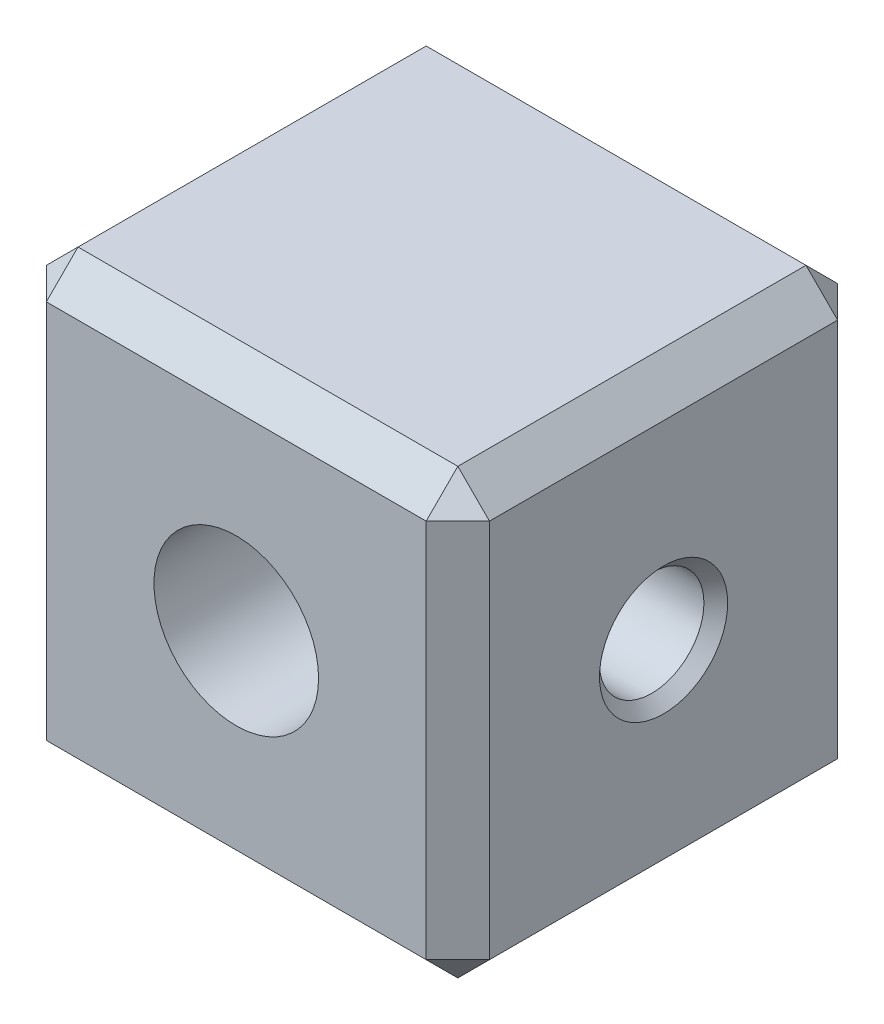
ISO-10303-21;
HEADER;
FILE_DESCRIPTION(('STEP AP214'),'2;1');
FILE_NAME('part.step','',(''),(''),'','','');
FILE_SCHEMA(('AUTOMOTIVE_DESIGN { 1 0 10303 214 1 1 1 1 }'));
ENDSEC;
DATA;
#1=APPLICATION_CONTEXT('core data for automotive mechanical design processes');
#2=APPLICATION_PROTOCOL_DEFINITION('international standard','automotive_design',2000,#1);
#3=PRODUCT_CONTEXT('',#1,'mechanical');
#4=PRODUCT('Part','Part','',(#3));
#5=PRODUCT_RELATED_PRODUCT_CATEGORY('part','',(#4));
#6=PRODUCT_DEFINITION_FORMATION('','',#4);
#7=PRODUCT_DEFINITION_CONTEXT('part definition',#1,'design');
#8=PRODUCT_DEFINITION('design','',#6,#7);
#9=PRODUCT_DEFINITION_SHAPE('','',#8);
#10=(LENGTH_UNIT() NAMED_UNIT(*) SI_UNIT(.MILLI.,.METRE.));
#11=(NAMED_UNIT(*) PLANE_ANGLE_UNIT() SI_UNIT($,.RADIAN.));
#12=(NAMED_UNIT(*) SI_UNIT($,.STERADIAN.) SOLID_ANGLE_UNIT());
#13=UNCERTAINTY_MEASURE_WITH_UNIT(LENGTH_MEASURE(1.E-05),#10,'distance_accuracy_value','');
#14=(GEOMETRIC_REPRESENTATION_CONTEXT(3) GLOBAL_UNCERTAINTY_ASSIGNED_CONTEXT((#13)) GLOBAL_UNIT_ASSIGNED_CONTEXT((#10,
#11,#12)) REPRESENTATION_CONTEXT('',''));
#15=CARTESIAN_POINT('',(0.,0.,0.));
#16=DIRECTION('',(0.,0.,1.));
#17=DIRECTION('',(1.,0.,0.));
#18=AXIS2_PLACEMENT_3D('',#15,#16,#17);
#19=CARTESIAN_POINT('',(0.,0.,13.));
#20=DIRECTION('',(0.,0.,1.));
#21=DIRECTION('',(1.,0.,0.));
#22=AXIS2_PLACEMENT_3D('',#19,#20,#21);
#23=PLANE('',#22);
#24=DIRECTION('',(0.,-1.,0.));
#25=VECTOR('',#24,1.);
#26=CARTESIAN_POINT('',(-6.,-7.,13.));
#27=LINE('',#26,#25);
#28=CARTESIAN_POINT('',(-6.,6.,13.));
#29=VERTEX_POINT('',#28);
#30=CARTESIAN_POINT('',(-6.,-6.,13.));
#31=VERTEX_POINT('',#30);
#32=EDGE_CURVE('E48',#29,#31,#27,.T.);
#33=ORIENTED_EDGE('',*,*,#32,.T.);
#34=DIRECTION('',(1.,0.,0.));
#35=VECTOR('',#34,1.);
#36=CARTESIAN_POINT('',(7.,-6.,13.));
#37=LINE('',#36,#35);
#38=CARTESIAN_POINT('',(6.,-6.,13.));
#39=VERTEX_POINT('',#38);
#40=EDGE_CURVE('E11',#31,#39,#37,.T.);
#41=ORIENTED_EDGE('',*,*,#40,.T.);
#42=DIRECTION('',(0.,1.,0.));
#43=VECTOR('',#42,1.);
#44=CARTESIAN_POINT('',(6.,7.,13.));
#45=LINE('',#44,#43);
#46=CARTESIAN_POINT('',(6.,6.,13.));
#47=VERTEX_POINT('',#46);
#48=EDGE_CURVE('E203',#39,#47,#45,.T.);
#49=ORIENTED_EDGE('',*,*,#48,.T.);
#50=DIRECTION('',(-1.,0.,0.));
#51=VECTOR('',#50,1.);
#52=CARTESIAN_POINT('',(-7.,6.,13.));
#53=LINE('',#52,#51);
#54=EDGE_CURVE('E59',#47,#29,#53,.T.);
#55=ORIENTED_EDGE('',*,*,#54,.T.);
#56=EDGE_LOOP('',(#33,#41,#49,#55));
#57=FACE_BOUND('',#56,.T.);
#58=CARTESIAN_POINT('',(0.,0.,13.));
#59=DIRECTION('',(0.,0.,1.));
#60=DIRECTION('',(1.,0.,0.));
#61=AXIS2_PLACEMENT_3D('',#58,#59,#60);
#62=CIRCLE('',#61,2.6);
#63=CARTESIAN_POINT('',(2.6,0.,13.));
#64=VERTEX_POINT('',#63);
#65=EDGE_CURVE('E159',#64,#64,#62,.T.);
#66=ORIENTED_EDGE('',*,*,#65,.F.);
#67=EDGE_LOOP('',(#66));
#68=FACE_BOUND('',#67,.T.);
#69=ADVANCED_FACE('F39',(#57,#68),#23,.T.);
#70=CARTESIAN_POINT('',(0.,0.,0.));
#71=DIRECTION('',(0.,0.,1.));
#72=DIRECTION('',(1.,0.,0.));
#73=AXIS2_PLACEMENT_3D('',#70,#71,#72);
#74=PLANE('',#73);
#75=DIRECTION('',(0.,-1.,0.));
#76=VECTOR('',#75,1.);
#77=CARTESIAN_POINT('',(6.,0.,0.));
#78=LINE('',#77,#76);
#79=CARTESIAN_POINT('',(6.,6.,0.));
#80=VERTEX_POINT('',#79);
#81=CARTESIAN_POINT('',(6.,-6.,0.));
#82=VERTEX_POINT('',#81);
#83=EDGE_CURVE('E166',#80,#82,#78,.T.);
#84=ORIENTED_EDGE('',*,*,#83,.T.);
#85=DIRECTION('',(-1.,0.,0.));
#86=VECTOR('',#85,1.);
#87=CARTESIAN_POINT('',(0.,-6.,0.));
#88=LINE('',#87,#86);
#89=CARTESIAN_POINT('',(-6.,-6.,0.));
#90=VERTEX_POINT('',#89);
#91=EDGE_CURVE('E135',#82,#90,#88,.T.);
#92=ORIENTED_EDGE('',*,*,#91,.T.);
#93=DIRECTION('',(0.,1.,0.));
#94=VECTOR('',#93,1.);
#95=CARTESIAN_POINT('',(-6.,0.,0.));
#96=LINE('',#95,#94);
#97=CARTESIAN_POINT('',(-6.,6.,0.));
#98=VERTEX_POINT('',#97);
#99=EDGE_CURVE('E173',#90,#98,#96,.T.);
#100=ORIENTED_EDGE('',*,*,#99,.T.);
#101=DIRECTION('',(1.,0.,0.));
#102=VECTOR('',#101,1.);
#103=CARTESIAN_POINT('',(0.,6.,0.));
#104=LINE('',#103,#102);
#105=EDGE_CURVE('E171',#98,#80,#104,.T.);
#106=ORIENTED_EDGE('',*,*,#105,.T.);
#107=EDGE_LOOP('',(#84,#92,#100,#106));
#108=FACE_BOUND('',#107,.T.);
#109=CARTESIAN_POINT('',(0.,0.,0.));
#110=DIRECTION('',(0.,0.,1.));
#111=DIRECTION('',(1.,0.,0.));
#112=AXIS2_PLACEMENT_3D('',#109,#110,#111);
#113=CIRCLE('',#112,2.6);
#114=CARTESIAN_POINT('',(2.6,0.,0.));
#115=VERTEX_POINT('',#114);
#116=EDGE_CURVE('E262',#115,#115,#113,.T.);
#117=ORIENTED_EDGE('',*,*,#116,.T.);
#118=EDGE_LOOP('',(#117));
#119=FACE_BOUND('',#118,.T.);
#120=ADVANCED_FACE('F296',(#108,#119),#74,.F.);
#121=CARTESIAN_POINT('',(-7.,7.,13.));
#122=DIRECTION('',(1.,0.,0.));
#123=DIRECTION('',(0.,0.,-1.));
#124=AXIS2_PLACEMENT_3D('',#121,#122,#123);
#125=PLANE('',#124);
#126=DIRECTION('',(0.,0.,-1.));
#127=VECTOR('',#126,1.);
#128=CARTESIAN_POINT('',(-7.,6.,13.));
#129=LINE('',#128,#127);
#130=CARTESIAN_POINT('',(-7.,6.,12.));
#131=VERTEX_POINT('',#130);
#132=CARTESIAN_POINT('',(-7.,6.,0.999999999999997));
#133=VERTEX_POINT('',#132);
#134=EDGE_CURVE('E176',#131,#133,#129,.T.);
#135=ORIENTED_EDGE('',*,*,#134,.T.);
#136=DIRECTION('',(0.,-1.,0.));
#137=VECTOR('',#136,1.);
#138=CARTESIAN_POINT('',(-7.,7.,0.999999999999997));
#139=LINE('',#138,#137);
#140=CARTESIAN_POINT('',(-7.,-6.,0.999999999999997));
#141=VERTEX_POINT('',#140);
#142=EDGE_CURVE('E182',#133,#141,#139,.T.);
#143=ORIENTED_EDGE('',*,*,#142,.T.);
#144=DIRECTION('',(0.,0.,1.));
#145=VECTOR('',#144,1.);
#146=CARTESIAN_POINT('',(-7.,-6.,13.));
#147=LINE('',#146,#145);
#148=CARTESIAN_POINT('',(-7.,-6.,12.));
#149=VERTEX_POINT('',#148);
#150=EDGE_CURVE('E180',#141,#149,#147,.T.);
#151=ORIENTED_EDGE('',*,*,#150,.T.);
#152=DIRECTION('',(0.,1.,0.));
#153=VECTOR('',#152,1.);
#154=CARTESIAN_POINT('',(-7.,7.,12.));
#155=LINE('',#154,#153);
#156=EDGE_CURVE('E178',#149,#131,#155,.T.);
#157=ORIENTED_EDGE('',*,*,#156,.T.);
#158=EDGE_LOOP('',(#135,#143,#151,#157));
#159=FACE_BOUND('',#158,.T.);
#160=ADVANCED_FACE('F301',(#159),#125,.F.);
#161=CARTESIAN_POINT('',(-7.,-7.,13.));
#162=DIRECTION('',(0.,1.,0.));
#163=DIRECTION('',(0.,0.,1.));
#164=AXIS2_PLACEMENT_3D('',#161,#162,#163);
#165=PLANE('',#164);
#166=DIRECTION('',(-1.,0.,0.));
#167=VECTOR('',#166,1.);
#168=CARTESIAN_POINT('',(-7.,-7.,12.));
#169=LINE('',#168,#167);
#170=CARTESIAN_POINT('',(6.,-7.,12.));
#171=VERTEX_POINT('',#170);
#172=CARTESIAN_POINT('',(-6.,-7.,12.));
#173=VERTEX_POINT('',#172);
#174=EDGE_CURVE('E158',#171,#173,#169,.T.);
#175=ORIENTED_EDGE('',*,*,#174,.T.);
#176=DIRECTION('',(0.,0.,-1.));
#177=VECTOR('',#176,1.);
#178=CARTESIAN_POINT('',(-6.,-7.,13.));
#179=LINE('',#178,#177);
#180=CARTESIAN_POINT('',(-6.,-7.,0.999999999999997));
#181=VERTEX_POINT('',#180);
#182=EDGE_CURVE('E163',#173,#181,#179,.T.);
#183=ORIENTED_EDGE('',*,*,#182,.T.);
#184=DIRECTION('',(1.,0.,0.));
#185=VECTOR('',#184,1.);
#186=CARTESIAN_POINT('',(-7.,-7.,0.999999999999997));
#187=LINE('',#186,#185);
#188=CARTESIAN_POINT('',(6.,-7.,0.999999999999997));
#189=VERTEX_POINT('',#188);
#190=EDGE_CURVE('E133',#181,#189,#187,.T.);
#191=ORIENTED_EDGE('',*,*,#190,.T.);
#192=DIRECTION('',(0.,0.,1.));
#193=VECTOR('',#192,1.);
#194=CARTESIAN_POINT('',(6.,-7.,13.));
#195=LINE('',#194,#193);
#196=EDGE_CURVE('E152',#189,#171,#195,.T.);
#197=ORIENTED_EDGE('',*,*,#196,.T.);
#198=EDGE_LOOP('',(#175,#183,#191,#197));
#199=FACE_BOUND('',#198,.T.);
#200=ADVANCED_FACE('F161',(#199),#165,.F.);
#201=CARTESIAN_POINT('',(7.,7.,13.));
#202=DIRECTION('',(-1.,0.,0.));
#203=DIRECTION('',(0.,0.,1.));
#204=AXIS2_PLACEMENT_3D('',#201,#202,#203);
#205=PLANE('',#204);
#206=CARTESIAN_POINT('',(7.,0.,6.5));
#207=DIRECTION('',(1.,0.,0.));
#208=DIRECTION('',(0.,0.,-1.));
#209=AXIS2_PLACEMENT_3D('',#206,#207,#208);
#210=CIRCLE('',#209,2.025);
#211=CARTESIAN_POINT('',(7.,0.,4.475));
#212=VERTEX_POINT('',#211);
#213=EDGE_CURVE('E596',#212,#212,#210,.T.);
#214=ORIENTED_EDGE('',*,*,#213,.F.);
#215=EDGE_LOOP('',(#214));
#216=FACE_BOUND('',#215,.T.);
#217=DIRECTION('',(0.,0.,-1.));
#218=VECTOR('',#217,1.);
#219=CARTESIAN_POINT('',(7.,-6.,13.));
#220=LINE('',#219,#218);
#221=CARTESIAN_POINT('',(7.,-6.,12.));
#222=VERTEX_POINT('',#221);
#223=CARTESIAN_POINT('',(7.,-6.,1.));
#224=VERTEX_POINT('',#223);
#225=EDGE_CURVE('E198',#222,#224,#220,.T.);
#226=ORIENTED_EDGE('',*,*,#225,.T.);
#227=DIRECTION('',(0.,1.,0.));
#228=VECTOR('',#227,1.);
#229=CARTESIAN_POINT('',(7.,7.,1.));
#230=LINE('',#229,#228);
#231=CARTESIAN_POINT('',(7.,6.,1.));
#232=VERTEX_POINT('',#231);
#233=EDGE_CURVE('E200',#224,#232,#230,.T.);
#234=ORIENTED_EDGE('',*,*,#233,.T.);
#235=DIRECTION('',(0.,0.,1.));
#236=VECTOR('',#235,1.);
#237=CARTESIAN_POINT('',(7.,6.,13.));
#238=LINE('',#237,#236);
#239=CARTESIAN_POINT('',(7.,6.,12.));
#240=VERTEX_POINT('',#239);
#241=EDGE_CURVE('E194',#232,#240,#238,.T.);
#242=ORIENTED_EDGE('',*,*,#241,.T.);
#243=DIRECTION('',(0.,-1.,0.));
#244=VECTOR('',#243,1.);
#245=CARTESIAN_POINT('',(7.,-7.,12.));
#246=LINE('',#245,#244);
#247=EDGE_CURVE('E196',#240,#222,#246,.T.);
#248=ORIENTED_EDGE('',*,*,#247,.T.);
#249=EDGE_LOOP('',(#226,#234,#242,#248));
#250=FACE_BOUND('',#249,.T.);
#251=ADVANCED_FACE('F310',(#216,#250),#205,.F.);
#252=CARTESIAN_POINT('',(-7.,7.,13.));
#253=DIRECTION('',(0.,-1.,0.));
#254=DIRECTION('',(0.,0.,-1.));
#255=AXIS2_PLACEMENT_3D('',#252,#253,#254);
#256=PLANE('',#255);
#257=DIRECTION('',(0.,0.,-1.));
#258=VECTOR('',#257,1.);
#259=CARTESIAN_POINT('',(6.,7.,13.));
#260=LINE('',#259,#258);
#261=CARTESIAN_POINT('',(6.,7.,12.));
#262=VERTEX_POINT('',#261);
#263=CARTESIAN_POINT('',(6.,7.,0.999999999999997));
#264=VERTEX_POINT('',#263);
#265=EDGE_CURVE('E185',#262,#264,#260,.T.);
#266=ORIENTED_EDGE('',*,*,#265,.T.);
#267=DIRECTION('',(-1.,0.,0.));
#268=VECTOR('',#267,1.);
#269=CARTESIAN_POINT('',(-7.,7.,0.999999999999997));
#270=LINE('',#269,#268);
#271=CARTESIAN_POINT('',(-6.,7.,0.999999999999997));
#272=VERTEX_POINT('',#271);
#273=EDGE_CURVE('E191',#264,#272,#270,.T.);
#274=ORIENTED_EDGE('',*,*,#273,.T.);
#275=DIRECTION('',(0.,0.,1.));
#276=VECTOR('',#275,1.);
#277=CARTESIAN_POINT('',(-6.,7.,13.));
#278=LINE('',#277,#276);
#279=CARTESIAN_POINT('',(-6.,7.,12.));
#280=VERTEX_POINT('',#279);
#281=EDGE_CURVE('E189',#272,#280,#278,.T.);
#282=ORIENTED_EDGE('',*,*,#281,.T.);
#283=DIRECTION('',(1.,0.,0.));
#284=VECTOR('',#283,1.);
#285=CARTESIAN_POINT('',(7.,7.,12.));
#286=LINE('',#285,#284);
#287=EDGE_CURVE('E187',#280,#262,#286,.T.);
#288=ORIENTED_EDGE('',*,*,#287,.T.);
#289=EDGE_LOOP('',(#266,#274,#282,#288));
#290=FACE_BOUND('',#289,.T.);
#291=ADVANCED_FACE('F307',(#290),#256,.F.);
#292=CARTESIAN_POINT('',(0.,0.,13.));
#293=DIRECTION('',(0.,0.,-1.));
#294=DIRECTION('',(-1.,0.,0.));
#295=AXIS2_PLACEMENT_3D('',#292,#293,#294);
#296=CYLINDRICAL_SURFACE('',#295,2.6);
#297=CARTESIAN_POINT('',(2.6,0.,4.85));
#298=CARTESIAN_POINT('',(2.59999356370089,-0.0836093642314581,4.85000700059255));
#299=CARTESIAN_POINT('',(2.5959252295781,-0.167308676056061,4.85639793701158));
#300=CARTESIAN_POINT('',(2.58003577662522,-0.332118757392289,4.88161305006881));
#301=CARTESIAN_POINT('',(2.56820161068242,-0.413224929341405,4.90045815090768));
#302=CARTESIAN_POINT('',(2.53796765926602,-0.570154711524236,4.94946809911244));
#303=CARTESIAN_POINT('',(2.51960031847659,-0.646002251569548,4.97957704617191));
#304=CARTESIAN_POINT('',(2.47781664516249,-0.791295104808913,5.04987143797332));
#305=CARTESIAN_POINT('',(2.45440062509063,-0.860740813820174,5.0900562591643));
#306=CARTESIAN_POINT('',(2.40219335819084,-0.9976260072881,5.18294635572659));
#307=CARTESIAN_POINT('',(2.37312020597309,-1.06444614080915,5.23640268485728));
#308=CARTESIAN_POINT('',(2.31335102088387,-1.18877099744268,5.35257832833362));
#309=CARTESIAN_POINT('',(2.2826528075994,-1.2462627614078,5.41531030137033));
#310=CARTESIAN_POINT('',(2.21791708873297,-1.35852905027988,5.55855932631681));
#311=CARTESIAN_POINT('',(2.18401638182949,-1.41178697683495,5.64033683634659));
#312=CARTESIAN_POINT('',(2.12180989805462,-1.50366496268702,5.81365536689642));
#313=CARTESIAN_POINT('',(2.09349461388748,-1.54231000015389,5.90517938101901));
#314=CARTESIAN_POINT('',(2.05358036977022,-1.59486499896372,6.07068980341234));
#315=CARTESIAN_POINT('',(2.03953813959552,-1.61262063885393,6.14286148216071));
#316=CARTESIAN_POINT('',(2.0189974531972,-1.6382698261245,6.28994257859242));
#317=CARTESIAN_POINT('',(2.01248782214465,-1.64617798386007,6.36484777028367));
#318=CARTESIAN_POINT('',(2.00799866084732,-1.65165288800548,6.51552121358026));
#319=CARTESIAN_POINT('',(2.01004400911384,-1.64918947297901,6.59129134242485));
#320=CARTESIAN_POINT('',(2.02238797034558,-1.63402424518222,6.74113563412977));
#321=CARTESIAN_POINT('',(2.03269332801284,-1.62131406537749,6.8152083601153));
#322=CARTESIAN_POINT('',(2.05967188257422,-1.5868860352564,6.95774423057467));
#323=CARTESIAN_POINT('',(2.07616418248291,-1.56542269148981,7.026305169073));
#324=CARTESIAN_POINT('',(2.11369192511533,-1.5143672053069,7.158977158673));
#325=CARTESIAN_POINT('',(2.13472895805424,-1.48477221661672,7.22308664179574));
#326=CARTESIAN_POINT('',(2.18382689618355,-1.41180028606423,7.35806716380616));
#327=CARTESIAN_POINT('',(2.21246180853596,-1.36687040098459,7.42788912574962));
#328=CARTESIAN_POINT('',(2.27093296372455,-1.2673602912087,7.55978003123358));
#329=CARTESIAN_POINT('',(2.30077044068726,-1.21276994718551,7.62184072735986));
#330=CARTESIAN_POINT('',(2.36443266756412,-1.0841871446121,7.74758906369522));
#331=CARTESIAN_POINT('',(2.39803675842848,-1.00847096100248,7.80964632449079));
#332=CARTESIAN_POINT('',(2.46012967486987,-0.845772529757307,7.92014873867386));
#333=CARTESIAN_POINT('',(2.48862014524628,-0.758793920239832,7.96859827183818));
#334=CARTESIAN_POINT('',(2.53607281269191,-0.580042700802505,8.04761492195032));
#335=CARTESIAN_POINT('',(2.55543699438584,-0.488720800822533,8.07894878570982));
#336=CARTESIAN_POINT('',(2.58431192732314,-0.300570754115079,8.12527014367639));
#337=CARTESIAN_POINT('',(2.59383751884737,-0.203751133439417,8.14028225900275));
#338=CARTESIAN_POINT('',(2.60121318248133,-0.0235436320646336,8.15191383665182));
#339=CARTESIAN_POINT('',(2.60062779053348,0.0596306967664661,8.15099779291021));
#340=CARTESIAN_POINT('',(2.59160566859351,0.224467362998155,8.13675041727987));
#341=CARTESIAN_POINT('',(2.58316965848562,0.306129838332104,8.12342022374099));
#342=CARTESIAN_POINT('',(2.55979990182258,0.461904185092877,8.08596237622017));
#343=CARTESIAN_POINT('',(2.54517908674,0.536190544248439,8.06235330565486));
#344=CARTESIAN_POINT('',(2.51068282254672,0.679646762371941,8.00550256537348));
#345=CARTESIAN_POINT('',(2.49080654122456,0.748815808783199,7.97225936999822));
#346=CARTESIAN_POINT('',(2.4450225061342,0.887533567994192,7.89347231112562));
#347=CARTESIAN_POINT('',(2.41871212089101,0.956439884382202,7.84703561591672));
#348=CARTESIAN_POINT('',(2.3634070763216,1.08594499727385,7.74500296715399));
#349=CARTESIAN_POINT('',(2.33440954830351,1.14653474011117,7.68939717450884));
#350=CARTESIAN_POINT('',(2.27147765374451,1.26715361439639,7.56099425449273));
#351=CARTESIAN_POINT('',(2.23745627513478,1.32573006620994,7.48686941720125));
#352=CARTESIAN_POINT('',(2.17237697021152,1.42987708059227,7.32879279353733));
#353=CARTESIAN_POINT('',(2.14131748034008,1.47545453081511,7.2448462446776));
#354=CARTESIAN_POINT('',(2.09210130637495,1.54419013259774,7.08636961998251));
#355=CARTESIAN_POINT('',(2.07260491678024,1.57002692028926,7.01342421083649));
#356=CARTESIAN_POINT('',(2.04060983780227,1.61139797373635,6.86323746801319));
#357=CARTESIAN_POINT('',(2.02809989459574,1.62694881566988,6.78600326472628));
#358=CARTESIAN_POINT('',(2.0119390129216,1.6468999577035,6.62862229105806));
#359=CARTESIAN_POINT('',(2.00834650222408,1.65122672499351,6.54845978544858));
#360=CARTESIAN_POINT('',(2.01085418935627,1.64817106857541,6.38849895824265));
#361=CARTESIAN_POINT('',(2.01695634850136,1.64078627551809,6.30870071361494));
#362=CARTESIAN_POINT('',(2.03676964053407,1.61610045730419,6.15956481565707));
#363=CARTESIAN_POINT('',(2.04970991572728,1.59979899891512,6.08994984628662));
#364=CARTESIAN_POINT('',(2.08103058857972,1.55883724079366,5.95453086556764));
#365=CARTESIAN_POINT('',(2.09941343631522,1.53417317574912,5.8887285865594));
#366=CARTESIAN_POINT('',(2.14265550615688,1.47329637910247,5.75288215052257));
#367=CARTESIAN_POINT('',(2.16805991410817,1.43595441939336,5.68352123077057));
#368=CARTESIAN_POINT('',(2.22119210614304,1.35231865039193,5.55139143373501));
#369=CARTESIAN_POINT('',(2.24892169040304,1.30601786813863,5.48862775041656));
#370=CARTESIAN_POINT('',(2.31046587581909,1.1944079732116,5.35773846434659));
#371=CARTESIAN_POINT('',(2.34432848450345,1.12714959315625,5.29128099437689));
#372=CARTESIAN_POINT('',(2.40900882635245,0.981353295590316,5.17017304730462));
#373=CARTESIAN_POINT('',(2.43982431171494,0.902807154574299,5.11553125164208));
#374=CARTESIAN_POINT('',(2.49576148177294,0.734261396186563,5.01915765648491));
#375=CARTESIAN_POINT('',(2.52078295958654,0.644097005801016,4.97764907608763));
#376=CARTESIAN_POINT('',(2.55129613627649,0.503201442446353,4.92781147356388));
#377=CARTESIAN_POINT('',(2.56029252882903,0.455339235058843,4.91327714002847));
#378=CARTESIAN_POINT('',(2.57568825121883,0.358111094457789,4.88855173100782));
#379=CARTESIAN_POINT('',(2.5820893949141,0.30874623750071,4.87835762182462));
#380=CARTESIAN_POINT('',(2.59134790140283,0.216228653810743,4.86365919901637));
#381=CARTESIAN_POINT('',(2.59458379523352,0.173209558573112,4.8585453837755));
#382=CARTESIAN_POINT('',(2.59891157166355,0.0868017385235098,4.85171387784196));
#383=CARTESIAN_POINT('',(2.60000334195841,0.0434129944696837,4.84999636504011));
#384=CARTESIAN_POINT('',(2.6,0.,4.85));
#385=B_SPLINE_CURVE_WITH_KNOTS('',3,(#297,#298,#299,#300,#301,#302,#303,#304,#305,#306,#307,
#308,#309,#310,#311,#312,#313,#314,#315,#316,#317,#318,#319,#320,#321,#322,#323,#324,#325,#326,
#327,#328,#329,#330,#331,#332,#333,#334,#335,#336,#337,#338,#339,#340,#341,#342,#343,#344,#345,
#346,#347,#348,#349,#350,#351,#352,#353,#354,#355,#356,#357,#358,#359,#360,#361,#362,#363,#364,
#365,#366,#367,#368,#369,#370,#371,#372,#373,#374,#375,#376,#377,#378,#379,#380,#381,#382,#383,
#384),.UNSPECIFIED.,.T.,.F.,(4,2,2,2,2,2,2,2,2,2,2,2,2,2,2,2,2,2,2,2,2,2,2,2,2,2,2,2,2,2,2,2,2,
2,2,2,2,2,2,2,2,2,2,4),(0.,0.250653998386589,0.501730193990588,0.751576529206108,
1.00140740635972,1.27149744230246,1.5419595380144,1.85042047574356,2.1583517441984,
2.38433515981588,2.60998289093041,2.8362872778464,3.06277664185536,3.28310329051229,
3.5035071573247,3.76602998659183,4.02882945399387,4.33780785815168,4.64668670040328,
4.94026941434551,5.23340864595111,5.48165855276289,5.72988569785298,5.96682466417014,
6.20380117264423,6.46427494376128,6.72503006266724,7.02497239781351,7.32475550892554,
7.56323694705796,7.80133312114238,8.04098525165743,8.28068587204113,8.49780822644537,
8.71502847155743,8.96246539202194,9.21009568156985,9.51003682597656,9.81019760570412,
10.1152156116238,10.2674576166297,10.4195930332442,10.5497348042577,10.6798833916293),.UNSPECIFIED.);
#386=CARTESIAN_POINT('',(2.6,0.,4.85));
#387=VERTEX_POINT('',#386);
#388=EDGE_CURVE('E139',#387,#387,#385,.T.);
#389=ORIENTED_EDGE('',*,*,#388,.F.);
#390=EDGE_LOOP('',(#389));
#391=FACE_BOUND('',#390,.T.);
#392=ORIENTED_EDGE('',*,*,#65,.T.);
#393=EDGE_LOOP('',(#392));
#394=FACE_BOUND('',#393,.T.);
#395=ORIENTED_EDGE('',*,*,#116,.F.);
#396=EDGE_LOOP('',(#395));
#397=FACE_BOUND('',#396,.T.);
#398=ADVANCED_FACE('F305',(#391,#394,#397),#296,.F.);
#399=CARTESIAN_POINT('',(0.,6.,13.));
#400=DIRECTION('',(0.,0.707106781186547,0.707106781186548));
#401=DIRECTION('',(1.,0.,0.));
#402=AXIS2_PLACEMENT_3D('',#399,#400,#401);
#403=PLANE('',#402);
#404=DIRECTION('',(0.,0.707106781186548,-0.707106781186546));
#405=VECTOR('',#404,1.);
#406=CARTESIAN_POINT('',(-6.,6.5,12.5));
#407=LINE('',#406,#405);
#408=EDGE_CURVE('E43',#29,#280,#407,.T.);
#409=ORIENTED_EDGE('',*,*,#408,.F.);
#410=ORIENTED_EDGE('',*,*,#54,.F.);
#411=DIRECTION('',(0.,-0.707106781186548,0.707106781186546));
#412=VECTOR('',#411,1.);
#413=CARTESIAN_POINT('',(6.,7.,12.));
#414=LINE('',#413,#412);
#415=EDGE_CURVE('E255',#262,#47,#414,.T.);
#416=ORIENTED_EDGE('',*,*,#415,.F.);
#417=ORIENTED_EDGE('',*,*,#287,.F.);
#418=EDGE_LOOP('',(#409,#410,#416,#417));
#419=FACE_BOUND('',#418,.T.);
#420=ADVANCED_FACE('F41',(#419),#403,.T.);
#421=CARTESIAN_POINT('',(-7.,6.,12.));
#422=DIRECTION('',(-0.577350269189628,0.577350269189624,0.577350269189625));
#423=DIRECTION('',(0.707106781186546,0.,0.707106781186549));
#424=AXIS2_PLACEMENT_3D('',#421,#422,#423);
#425=PLANE('',#424);
#426=DIRECTION('',(0.707106781186546,0.,0.707106781186549));
#427=VECTOR('',#426,1.);
#428=CARTESIAN_POINT('',(-7.,6.,12.));
#429=LINE('',#428,#427);
#430=EDGE_CURVE('E250',#29,#131,#429,.F.);
#431=ORIENTED_EDGE('',*,*,#430,.F.);
#432=ORIENTED_EDGE('',*,*,#408,.T.);
#433=DIRECTION('',(0.707106781186546,0.707106781186549,0.));
#434=VECTOR('',#433,1.);
#435=CARTESIAN_POINT('',(-7.,6.,12.));
#436=LINE('',#435,#434);
#437=EDGE_CURVE('E253',#131,#280,#436,.T.);
#438=ORIENTED_EDGE('',*,*,#437,.F.);
#439=EDGE_LOOP('',(#431,#432,#438));
#440=FACE_BOUND('',#439,.T.);
#441=ADVANCED_FACE('F384',(#440),#425,.T.);
#442=CARTESIAN_POINT('',(6.,7.,12.));
#443=DIRECTION('',(0.577350269189628,0.577350269189624,0.577350269189626));
#444=DIRECTION('',(0.707106781186546,0.,-0.707106781186549));
#445=AXIS2_PLACEMENT_3D('',#442,#443,#444);
#446=PLANE('',#445);
#447=DIRECTION('',(0.707106781186546,-0.707106781186549,0.));
#448=VECTOR('',#447,1.);
#449=CARTESIAN_POINT('',(6.,7.,12.));
#450=LINE('',#449,#448);
#451=EDGE_CURVE('E244',#262,#240,#450,.T.);
#452=ORIENTED_EDGE('',*,*,#451,.F.);
#453=ORIENTED_EDGE('',*,*,#415,.T.);
#454=DIRECTION('',(0.707106781186546,0.,-0.707106781186549));
#455=VECTOR('',#454,1.);
#456=CARTESIAN_POINT('',(6.5,6.,12.5));
#457=LINE('',#456,#455);
#458=EDGE_CURVE('E247',#240,#47,#457,.F.);
#459=ORIENTED_EDGE('',*,*,#458,.F.);
#460=EDGE_LOOP('',(#452,#453,#459));
#461=FACE_BOUND('',#460,.T.);
#462=ADVANCED_FACE('F381',(#461),#446,.T.);
#463=CARTESIAN_POINT('',(-7.,6.,13.));
#464=DIRECTION('',(0.707106781186549,-0.707106781186546,0.));
#465=DIRECTION('',(0.,0.,-1.));
#466=AXIS2_PLACEMENT_3D('',#463,#464,#465);
#467=PLANE('',#466);
#468=ORIENTED_EDGE('',*,*,#437,.T.);
#469=ORIENTED_EDGE('',*,*,#281,.F.);
#470=DIRECTION('',(-0.707106781186546,-0.707106781186549,0.));
#471=VECTOR('',#470,1.);
#472=CARTESIAN_POINT('',(-6.5,6.5,0.999999999999997));
#473=LINE('',#472,#471);
#474=EDGE_CURVE('E239',#133,#272,#473,.F.);
#475=ORIENTED_EDGE('',*,*,#474,.F.);
#476=ORIENTED_EDGE('',*,*,#134,.F.);
#477=EDGE_LOOP('',(#468,#469,#475,#476));
#478=FACE_BOUND('',#477,.T.);
#479=ADVANCED_FACE('F377',(#478),#467,.F.);
#480=CARTESIAN_POINT('',(-6.,0.,13.));
#481=DIRECTION('',(-0.707106781186549,0.,0.707106781186546));
#482=DIRECTION('',(0.,1.,0.));
#483=AXIS2_PLACEMENT_3D('',#480,#481,#482);
#484=PLANE('',#483);
#485=ORIENTED_EDGE('',*,*,#430,.T.);
#486=ORIENTED_EDGE('',*,*,#156,.F.);
#487=DIRECTION('',(-0.707106781186546,0.,-0.707106781186549));
#488=VECTOR('',#487,1.);
#489=CARTESIAN_POINT('',(-6.5,-6.,12.5));
#490=LINE('',#489,#488);
#491=EDGE_CURVE('E236',#31,#149,#490,.T.);
#492=ORIENTED_EDGE('',*,*,#491,.F.);
#493=ORIENTED_EDGE('',*,*,#32,.F.);
#494=EDGE_LOOP('',(#485,#486,#492,#493));
#495=FACE_BOUND('',#494,.T.);
#496=ADVANCED_FACE('F373',(#495),#484,.T.);
#497=CARTESIAN_POINT('',(0.,-6.,13.));
#498=DIRECTION('',(0.,-0.707106781186549,0.707106781186546));
#499=DIRECTION('',(-1.,0.,0.));
#500=AXIS2_PLACEMENT_3D('',#497,#498,#499);
#501=PLANE('',#500);
#502=DIRECTION('',(0.,-0.707106781186546,-0.707106781186549));
#503=VECTOR('',#502,1.);
#504=CARTESIAN_POINT('',(6.,-6.,13.));
#505=LINE('',#504,#503);
#506=EDGE_CURVE('E230',#39,#171,#505,.T.);
#507=ORIENTED_EDGE('',*,*,#506,.F.);
#508=ORIENTED_EDGE('',*,*,#40,.F.);
#509=DIRECTION('',(0.,0.707106781186546,0.707106781186549));
#510=VECTOR('',#509,1.);
#511=CARTESIAN_POINT('',(-6.,-7.,12.));
#512=LINE('',#511,#510);
#513=EDGE_CURVE('E233',#173,#31,#512,.T.);
#514=ORIENTED_EDGE('',*,*,#513,.F.);
#515=ORIENTED_EDGE('',*,*,#174,.F.);
#516=EDGE_LOOP('',(#507,#508,#514,#515));
#517=FACE_BOUND('',#516,.T.);
#518=ADVANCED_FACE('F369',(#517),#501,.T.);
#519=CARTESIAN_POINT('',(6.,0.,13.));
#520=DIRECTION('',(0.707106781186549,0.,0.707106781186546));
#521=DIRECTION('',(0.,-1.,0.));
#522=AXIS2_PLACEMENT_3D('',#519,#520,#521);
#523=PLANE('',#522);
#524=ORIENTED_EDGE('',*,*,#458,.T.);
#525=ORIENTED_EDGE('',*,*,#48,.F.);
#526=DIRECTION('',(-0.707106781186546,0.,0.707106781186549));
#527=VECTOR('',#526,1.);
#528=CARTESIAN_POINT('',(6.,-6.,13.));
#529=LINE('',#528,#527);
#530=EDGE_CURVE('E228',#222,#39,#529,.T.);
#531=ORIENTED_EDGE('',*,*,#530,.F.);
#532=ORIENTED_EDGE('',*,*,#247,.F.);
#533=EDGE_LOOP('',(#524,#525,#531,#532));
#534=FACE_BOUND('',#533,.T.);
#535=ADVANCED_FACE('F365',(#534),#523,.T.);
#536=CARTESIAN_POINT('',(6.,7.,13.));
#537=DIRECTION('',(-0.707106781186549,-0.707106781186546,0.));
#538=DIRECTION('',(0.,0.,-1.));
#539=AXIS2_PLACEMENT_3D('',#536,#537,#538);
#540=PLANE('',#539);
#541=ORIENTED_EDGE('',*,*,#451,.T.);
#542=ORIENTED_EDGE('',*,*,#241,.F.);
#543=DIRECTION('',(-0.707106781186546,0.707106781186549,0.));
#544=VECTOR('',#543,1.);
#545=CARTESIAN_POINT('',(6.5,6.5,0.999999999999999));
#546=LINE('',#545,#544);
#547=EDGE_CURVE('E225',#264,#232,#546,.F.);
#548=ORIENTED_EDGE('',*,*,#547,.F.);
#549=ORIENTED_EDGE('',*,*,#265,.F.);
#550=EDGE_LOOP('',(#541,#542,#548,#549));
#551=FACE_BOUND('',#550,.T.);
#552=ADVANCED_FACE('F361',(#551),#540,.F.);
#553=CARTESIAN_POINT('',(-7.,7.,0.999999999999997));
#554=DIRECTION('',(0.,-0.707106781186547,0.707106781186548));
#555=DIRECTION('',(-1.,0.,0.));
#556=AXIS2_PLACEMENT_3D('',#553,#554,#555);
#557=PLANE('',#556);
#558=DIRECTION('',(0.,0.707106781186548,0.707106781186547));
#559=VECTOR('',#558,1.);
#560=CARTESIAN_POINT('',(-6.,6.,0.));
#561=LINE('',#560,#559);
#562=EDGE_CURVE('E241',#272,#98,#561,.F.);
#563=ORIENTED_EDGE('',*,*,#562,.F.);
#564=ORIENTED_EDGE('',*,*,#273,.F.);
#565=DIRECTION('',(0.,-0.707106781186548,-0.707106781186547));
#566=VECTOR('',#565,1.);
#567=CARTESIAN_POINT('',(6.,6.,0.));
#568=LINE('',#567,#566);
#569=EDGE_CURVE('E222',#80,#264,#568,.F.);
#570=ORIENTED_EDGE('',*,*,#569,.F.);
#571=ORIENTED_EDGE('',*,*,#105,.F.);
#572=EDGE_LOOP('',(#563,#564,#570,#571));
#573=FACE_BOUND('',#572,.T.);
#574=ADVANCED_FACE('F357',(#573),#557,.F.);
#575=CARTESIAN_POINT('',(-6.,6.,0.));
#576=DIRECTION('',(-0.577350269189626,0.577350269189624,-0.577350269189627));
#577=DIRECTION('',(-0.707106781186548,0.,0.707106781186547));
#578=AXIS2_PLACEMENT_3D('',#575,#576,#577);
#579=PLANE('',#578);
#580=ORIENTED_EDGE('',*,*,#474,.T.);
#581=ORIENTED_EDGE('',*,*,#562,.T.);
#582=DIRECTION('',(0.707106781186548,0.,-0.707106781186547));
#583=VECTOR('',#582,1.);
#584=CARTESIAN_POINT('',(-6.,6.,0.));
#585=LINE('',#584,#583);
#586=EDGE_CURVE('E219',#133,#98,#585,.T.);
#587=ORIENTED_EDGE('',*,*,#586,.F.);
#588=EDGE_LOOP('',(#580,#581,#587));
#589=FACE_BOUND('',#588,.T.);
#590=ADVANCED_FACE('F353',(#589),#579,.T.);
#591=CARTESIAN_POINT('',(-6.,-7.,12.));
#592=DIRECTION('',(-0.577350269189628,-0.577350269189626,0.577350269189624));
#593=DIRECTION('',(0.707106781186547,-0.707106781186548,0.));
#594=AXIS2_PLACEMENT_3D('',#591,#592,#593);
#595=PLANE('',#594);
#596=ORIENTED_EDGE('',*,*,#513,.T.);
#597=ORIENTED_EDGE('',*,*,#491,.T.);
#598=DIRECTION('',(-0.707106781186547,0.707106781186548,0.));
#599=VECTOR('',#598,1.);
#600=CARTESIAN_POINT('',(-6.,-7.,12.));
#601=LINE('',#600,#599);
#602=EDGE_CURVE('E216',#173,#149,#601,.T.);
#603=ORIENTED_EDGE('',*,*,#602,.F.);
#604=EDGE_LOOP('',(#596,#597,#603));
#605=FACE_BOUND('',#604,.T.);
#606=ADVANCED_FACE('F349',(#605),#595,.T.);
#607=CARTESIAN_POINT('',(6.,-6.,13.));
#608=DIRECTION('',(0.577350269189628,-0.577350269189626,0.577350269189624));
#609=DIRECTION('',(0.707106781186546,0.707106781186549,0.));
#610=AXIS2_PLACEMENT_3D('',#607,#608,#609);
#611=PLANE('',#610);
#612=ORIENTED_EDGE('',*,*,#530,.T.);
#613=ORIENTED_EDGE('',*,*,#506,.T.);
#614=DIRECTION('',(-0.707106781186546,-0.707106781186549,0.));
#615=VECTOR('',#614,1.);
#616=CARTESIAN_POINT('',(6.5,-6.5,12.));
#617=LINE('',#616,#615);
#618=EDGE_CURVE('E155',#222,#171,#617,.T.);
#619=ORIENTED_EDGE('',*,*,#618,.F.);
#620=EDGE_LOOP('',(#612,#613,#619));
#621=FACE_BOUND('',#620,.T.);
#622=ADVANCED_FACE('F345',(#621),#611,.T.);
#623=CARTESIAN_POINT('',(6.,6.,0.));
#624=DIRECTION('',(0.577350269189628,0.577350269189624,-0.577350269189626));
#625=DIRECTION('',(-0.707106781186546,0.,-0.707106781186549));
#626=AXIS2_PLACEMENT_3D('',#623,#624,#625);
#627=PLANE('',#626);
#628=ORIENTED_EDGE('',*,*,#569,.T.);
#629=ORIENTED_EDGE('',*,*,#547,.T.);
#630=DIRECTION('',(0.707106781186546,0.,0.707106781186549));
#631=VECTOR('',#630,1.);
#632=CARTESIAN_POINT('',(6.,6.,0.));
#633=LINE('',#632,#631);
#634=EDGE_CURVE('E213',#80,#232,#633,.T.);
#635=ORIENTED_EDGE('',*,*,#634,.F.);
#636=EDGE_LOOP('',(#628,#629,#635));
#637=FACE_BOUND('',#636,.T.);
#638=ADVANCED_FACE('F341',(#637),#627,.T.);
#639=CARTESIAN_POINT('',(-7.,7.,0.999999999999997));
#640=DIRECTION('',(0.707106781186547,0.,0.707106781186548));
#641=DIRECTION('',(0.,-1.,0.));
#642=AXIS2_PLACEMENT_3D('',#639,#640,#641);
#643=PLANE('',#642);
#644=ORIENTED_EDGE('',*,*,#586,.T.);
#645=ORIENTED_EDGE('',*,*,#99,.F.);
#646=DIRECTION('',(-0.707106781186549,0.,0.707106781186547));
#647=VECTOR('',#646,1.);
#648=CARTESIAN_POINT('',(-6.,-6.,0.));
#649=LINE('',#648,#647);
#650=EDGE_CURVE('E210',#141,#90,#649,.F.);
#651=ORIENTED_EDGE('',*,*,#650,.F.);
#652=ORIENTED_EDGE('',*,*,#142,.F.);
#653=EDGE_LOOP('',(#644,#645,#651,#652));
#654=FACE_BOUND('',#653,.T.);
#655=ADVANCED_FACE('F337',(#654),#643,.F.);
#656=CARTESIAN_POINT('',(-6.,-7.,13.));
#657=DIRECTION('',(0.707106781186548,0.707106781186547,0.));
#658=DIRECTION('',(0.,0.,-1.));
#659=AXIS2_PLACEMENT_3D('',#656,#657,#658);
#660=PLANE('',#659);
#661=ORIENTED_EDGE('',*,*,#602,.T.);
#662=ORIENTED_EDGE('',*,*,#150,.F.);
#663=DIRECTION('',(0.707106781186547,-0.707106781186548,0.));
#664=VECTOR('',#663,1.);
#665=CARTESIAN_POINT('',(-6.5,-6.5,0.999999999999997));
#666=LINE('',#665,#664);
#667=EDGE_CURVE('E149',#181,#141,#666,.F.);
#668=ORIENTED_EDGE('',*,*,#667,.F.);
#669=ORIENTED_EDGE('',*,*,#182,.F.);
#670=EDGE_LOOP('',(#661,#662,#668,#669));
#671=FACE_BOUND('',#670,.T.);
#672=ADVANCED_FACE('F334',(#671),#660,.F.);
#673=CARTESIAN_POINT('',(7.,-6.,13.));
#674=DIRECTION('',(-0.707106781186549,0.707106781186546,0.));
#675=DIRECTION('',(0.,0.,-1.));
#676=AXIS2_PLACEMENT_3D('',#673,#674,#675);
#677=PLANE('',#676);
#678=ORIENTED_EDGE('',*,*,#618,.T.);
#679=ORIENTED_EDGE('',*,*,#196,.F.);
#680=DIRECTION('',(0.707106781186546,0.707106781186549,0.));
#681=VECTOR('',#680,1.);
#682=CARTESIAN_POINT('',(6.,-7.,0.999999999999997));
#683=LINE('',#682,#681);
#684=EDGE_CURVE('E142',#224,#189,#683,.F.);
#685=ORIENTED_EDGE('',*,*,#684,.F.);
#686=ORIENTED_EDGE('',*,*,#225,.F.);
#687=EDGE_LOOP('',(#678,#679,#685,#686));
#688=FACE_BOUND('',#687,.T.);
#689=ADVANCED_FACE('F153',(#688),#677,.F.);
#690=CARTESIAN_POINT('',(7.,7.,1.));
#691=DIRECTION('',(-0.707106781186549,0.,0.707106781186546));
#692=DIRECTION('',(0.,1.,0.));
#693=AXIS2_PLACEMENT_3D('',#690,#691,#692);
#694=PLANE('',#693);
#695=ORIENTED_EDGE('',*,*,#634,.T.);
#696=ORIENTED_EDGE('',*,*,#233,.F.);
#697=DIRECTION('',(-0.707106781186546,0.,-0.707106781186549));
#698=VECTOR('',#697,1.);
#699=CARTESIAN_POINT('',(6.5,-6.,0.500000000000002));
#700=LINE('',#699,#698);
#701=EDGE_CURVE('E146',#82,#224,#700,.F.);
#702=ORIENTED_EDGE('',*,*,#701,.F.);
#703=ORIENTED_EDGE('',*,*,#83,.F.);
#704=EDGE_LOOP('',(#695,#696,#702,#703));
#705=FACE_BOUND('',#704,.T.);
#706=ADVANCED_FACE('F327',(#705),#694,.F.);
#707=CARTESIAN_POINT('',(-6.,-6.,0.));
#708=DIRECTION('',(-0.577350269189626,-0.577350269189624,-0.577350269189628));
#709=DIRECTION('',(-0.707106781186549,0.,0.707106781186546));
#710=AXIS2_PLACEMENT_3D('',#707,#708,#709);
#711=PLANE('',#710);
#712=ORIENTED_EDGE('',*,*,#667,.T.);
#713=ORIENTED_EDGE('',*,*,#650,.T.);
#714=DIRECTION('',(0.,0.707106781186548,-0.707106781186547));
#715=VECTOR('',#714,1.);
#716=CARTESIAN_POINT('',(-6.,-6.,0.));
#717=LINE('',#716,#715);
#718=EDGE_CURVE('E138',#181,#90,#717,.T.);
#719=ORIENTED_EDGE('',*,*,#718,.F.);
#720=EDGE_LOOP('',(#712,#713,#719));
#721=FACE_BOUND('',#720,.T.);
#722=ADVANCED_FACE('F324',(#721),#711,.T.);
#723=CARTESIAN_POINT('',(6.,-7.,0.999999999999997));
#724=DIRECTION('',(0.577350269189628,-0.577350269189624,-0.577350269189626));
#725=DIRECTION('',(-0.707106781186546,0.,-0.707106781186549));
#726=AXIS2_PLACEMENT_3D('',#723,#724,#725);
#727=PLANE('',#726);
#728=ORIENTED_EDGE('',*,*,#701,.T.);
#729=ORIENTED_EDGE('',*,*,#684,.T.);
#730=DIRECTION('',(0.,-0.707106781186548,0.707106781186547));
#731=VECTOR('',#730,1.);
#732=CARTESIAN_POINT('',(6.,-7.,0.999999999999997));
#733=LINE('',#732,#731);
#734=EDGE_CURVE('E129',#82,#189,#733,.T.);
#735=ORIENTED_EDGE('',*,*,#734,.F.);
#736=EDGE_LOOP('',(#728,#729,#735));
#737=FACE_BOUND('',#736,.T.);
#738=ADVANCED_FACE('F144',(#737),#727,.T.);
#739=CARTESIAN_POINT('',(-7.,-7.,0.999999999999997));
#740=DIRECTION('',(0.,0.707106781186547,0.707106781186548));
#741=DIRECTION('',(1.,0.,0.));
#742=AXIS2_PLACEMENT_3D('',#739,#740,#741);
#743=PLANE('',#742);
#744=ORIENTED_EDGE('',*,*,#718,.T.);
#745=ORIENTED_EDGE('',*,*,#91,.F.);
#746=ORIENTED_EDGE('',*,*,#734,.T.);
#747=ORIENTED_EDGE('',*,*,#190,.F.);
#748=EDGE_LOOP('',(#744,#745,#746,#747));
#749=FACE_BOUND('',#748,.T.);
#750=ADVANCED_FACE('F131',(#749),#743,.F.);
#751=CARTESIAN_POINT('',(7.,0.,6.5));
#752=DIRECTION('',(1.,0.,0.));
#753=DIRECTION('',(0.,0.,-1.));
#754=AXIS2_PLACEMENT_3D('',#751,#752,#753);
#755=CYLINDRICAL_SURFACE('',#754,1.65);
#756=CARTESIAN_POINT('',(6.625,0.,6.5));
#757=DIRECTION('',(1.,0.,0.));
#758=DIRECTION('',(0.,0.,-1.));
#759=AXIS2_PLACEMENT_3D('',#756,#757,#758);
#760=CIRCLE('',#759,1.65);
#761=CARTESIAN_POINT('',(6.625,0.,4.85));
#762=VERTEX_POINT('',#761);
#763=EDGE_CURVE('E279',#762,#762,#760,.T.);
#764=ORIENTED_EDGE('',*,*,#763,.T.);
#765=EDGE_LOOP('',(#764));
#766=FACE_BOUND('',#765,.T.);
#767=ORIENTED_EDGE('',*,*,#388,.T.);
#768=EDGE_LOOP('',(#767));
#769=FACE_BOUND('',#768,.T.);
#770=ADVANCED_FACE('F283',(#766,#769),#755,.F.);
#771=CARTESIAN_POINT('',(7.,0.,6.5));
#772=DIRECTION('',(1.,0.,0.));
#773=DIRECTION('',(0.,0.,-1.));
#774=AXIS2_PLACEMENT_3D('',#771,#772,#773);
#775=CONICAL_SURFACE('',#774,2.025,0.785398163397446);
#776=ORIENTED_EDGE('',*,*,#763,.F.);
#777=EDGE_LOOP('',(#776));
#778=FACE_BOUND('',#777,.T.);
#779=ORIENTED_EDGE('',*,*,#213,.T.);
#780=EDGE_LOOP('',(#779));
#781=FACE_BOUND('',#780,.T.);
#782=ADVANCED_FACE('F287',(#778,#781),#775,.F.);
#783=CLOSED_SHELL('',(#69,#120,#160,#200,#251,#291,#398,#420,#441,#462,#479,#496,#518,#535,#552,
#574,#590,#606,#622,#638,#655,#672,#689,#706,#722,#738,#750,#770,#782));
#784=MANIFOLD_SOLID_BREP('B2',#783);
#785=ADVANCED_BREP_SHAPE_REPRESENTATION('',(#18,#784),#14);
#786=SHAPE_DEFINITION_REPRESENTATION(#9,#785);
ENDSEC;
END-ISO-10303-21;
